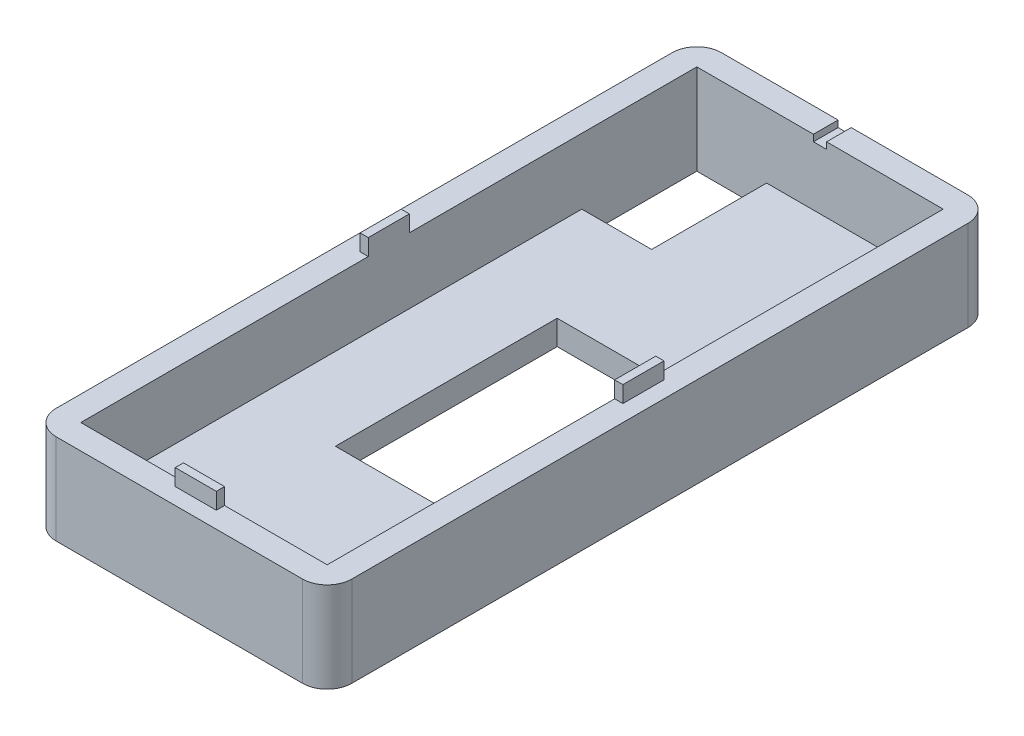
ISO-10303-21;
HEADER;
FILE_DESCRIPTION(('STEP AP214'),'2;1');
FILE_NAME('part.step','',(''),(''),'','','');
FILE_SCHEMA(('AUTOMOTIVE_DESIGN { 1 0 10303 214 1 1 1 1 }'));
ENDSEC;
DATA;
#1=APPLICATION_CONTEXT('core data for automotive mechanical design processes');
#2=APPLICATION_PROTOCOL_DEFINITION('international standard','automotive_design',2000,#1);
#3=PRODUCT_CONTEXT('',#1,'mechanical');
#4=PRODUCT('Part','Part','',(#3));
#5=PRODUCT_RELATED_PRODUCT_CATEGORY('part','',(#4));
#6=PRODUCT_DEFINITION_FORMATION('','',#4);
#7=PRODUCT_DEFINITION_CONTEXT('part definition',#1,'design');
#8=PRODUCT_DEFINITION('design','',#6,#7);
#9=PRODUCT_DEFINITION_SHAPE('','',#8);
#10=(LENGTH_UNIT() NAMED_UNIT(*) SI_UNIT(.MILLI.,.METRE.));
#11=(NAMED_UNIT(*) PLANE_ANGLE_UNIT() SI_UNIT($,.RADIAN.));
#12=(NAMED_UNIT(*) SI_UNIT($,.STERADIAN.) SOLID_ANGLE_UNIT());
#13=UNCERTAINTY_MEASURE_WITH_UNIT(LENGTH_MEASURE(1.E-05),#10,'distance_accuracy_value','');
#14=(GEOMETRIC_REPRESENTATION_CONTEXT(3) GLOBAL_UNCERTAINTY_ASSIGNED_CONTEXT((#13)) GLOBAL_UNIT_ASSIGNED_CONTEXT((#10,
#11,#12)) REPRESENTATION_CONTEXT('',''));
#15=CARTESIAN_POINT('',(0.,0.,0.));
#16=DIRECTION('',(0.,0.,1.));
#17=DIRECTION('',(1.,0.,0.));
#18=AXIS2_PLACEMENT_3D('',#15,#16,#17);
#19=CARTESIAN_POINT('',(0.,11.,0.));
#20=DIRECTION('',(0.,-1.,0.));
#21=DIRECTION('',(0.,0.,-1.));
#22=AXIS2_PLACEMENT_3D('',#19,#20,#21);
#23=PLANE('',#22);
#24=DIRECTION('',(0.,0.,1.));
#25=VECTOR('',#24,1.);
#26=CARTESIAN_POINT('',(15.5,11.,-3.));
#27=LINE('',#26,#25);
#28=CARTESIAN_POINT('',(15.5,11.,-3.));
#29=VERTEX_POINT('',#28);
#30=CARTESIAN_POINT('',(15.5,11.,-2.));
#31=VERTEX_POINT('',#30);
#32=EDGE_CURVE('E293',#29,#31,#27,.T.);
#33=ORIENTED_EDGE('',*,*,#32,.F.);
#34=DIRECTION('',(1.,0.,0.));
#35=VECTOR('',#34,1.);
#36=CARTESIAN_POINT('',(3.,11.,-3.));
#37=LINE('',#36,#35);
#38=CARTESIAN_POINT('',(3.,11.,-3.));
#39=VERTEX_POINT('',#38);
#40=EDGE_CURVE('E436',#39,#29,#37,.T.);
#41=ORIENTED_EDGE('',*,*,#40,.F.);
#42=DIRECTION('',(0.,0.,1.));
#43=VECTOR('',#42,1.);
#44=CARTESIAN_POINT('',(3.,11.,-3.));
#45=LINE('',#44,#43);
#46=CARTESIAN_POINT('',(3.,11.,-38.));
#47=VERTEX_POINT('',#46);
#48=EDGE_CURVE('E412',#47,#39,#45,.T.);
#49=ORIENTED_EDGE('',*,*,#48,.F.);
#50=DIRECTION('',(1.,0.,0.));
#51=VECTOR('',#50,1.);
#52=CARTESIAN_POINT('',(3.,11.,-38.));
#53=LINE('',#52,#51);
#54=CARTESIAN_POINT('',(2.,11.,-38.));
#55=VERTEX_POINT('',#54);
#56=EDGE_CURVE('E369',#55,#47,#53,.T.);
#57=ORIENTED_EDGE('',*,*,#56,.F.);
#58=DIRECTION('',(0.,0.,1.));
#59=VECTOR('',#58,1.);
#60=CARTESIAN_POINT('',(2.,11.,-43.));
#61=LINE('',#60,#59);
#62=CARTESIAN_POINT('',(2.,11.,-43.));
#63=VERTEX_POINT('',#62);
#64=EDGE_CURVE('E378',#63,#55,#61,.T.);
#65=ORIENTED_EDGE('',*,*,#64,.F.);
#66=DIRECTION('',(-1.,0.,0.));
#67=VECTOR('',#66,1.);
#68=CARTESIAN_POINT('',(3.,11.,-43.));
#69=LINE('',#68,#67);
#70=CARTESIAN_POINT('',(3.,11.,-43.));
#71=VERTEX_POINT('',#70);
#72=EDGE_CURVE('E364',#71,#63,#69,.T.);
#73=ORIENTED_EDGE('',*,*,#72,.F.);
#74=CARTESIAN_POINT('',(3.,11.,-78.));
#75=VERTEX_POINT('',#74);
#76=EDGE_CURVE('E432',#75,#71,#45,.T.);
#77=ORIENTED_EDGE('',*,*,#76,.F.);
#78=DIRECTION('',(-1.,0.,0.));
#79=VECTOR('',#78,1.);
#80=CARTESIAN_POINT('',(3.,11.,-78.));
#81=LINE('',#80,#79);
#82=CARTESIAN_POINT('',(17.2,11.,-78.));
#83=VERTEX_POINT('',#82);
#84=EDGE_CURVE('E443',#83,#75,#81,.T.);
#85=ORIENTED_EDGE('',*,*,#84,.F.);
#86=DIRECTION('',(0.,0.,1.));
#87=VECTOR('',#86,1.);
#88=CARTESIAN_POINT('',(17.2,11.,-81.));
#89=LINE('',#88,#87);
#90=CARTESIAN_POINT('',(17.2,11.,-81.));
#91=VERTEX_POINT('',#90);
#92=EDGE_CURVE('E394',#91,#83,#89,.T.);
#93=ORIENTED_EDGE('',*,*,#92,.F.);
#94=DIRECTION('',(-1.,0.,0.));
#95=VECTOR('',#94,1.);
#96=CARTESIAN_POINT('',(0.,11.,-81.));
#97=LINE('',#96,#95);
#98=CARTESIAN_POINT('',(3.,11.,-81.));
#99=VERTEX_POINT('',#98);
#100=EDGE_CURVE('E466',#91,#99,#97,.T.);
#101=ORIENTED_EDGE('',*,*,#100,.T.);
#102=CARTESIAN_POINT('',(3.,11.,-78.));
#103=DIRECTION('',(0.,-1.,0.));
#104=DIRECTION('',(0.,0.,-1.));
#105=AXIS2_PLACEMENT_3D('',#102,#103,#104);
#106=CIRCLE('',#105,3.);
#107=CARTESIAN_POINT('',(0.,11.,-78.));
#108=VERTEX_POINT('',#107);
#109=EDGE_CURVE('E498',#99,#108,#106,.F.);
#110=ORIENTED_EDGE('',*,*,#109,.T.);
#111=DIRECTION('',(0.,0.,1.));
#112=VECTOR('',#111,1.);
#113=CARTESIAN_POINT('',(0.,11.,0.));
#114=LINE('',#113,#112);
#115=CARTESIAN_POINT('',(0.,11.,-3.));
#116=VERTEX_POINT('',#115);
#117=EDGE_CURVE('E456',#108,#116,#114,.T.);
#118=ORIENTED_EDGE('',*,*,#117,.T.);
#119=CARTESIAN_POINT('',(3.,11.,-3.));
#120=DIRECTION('',(0.,-1.,0.));
#121=DIRECTION('',(0.,0.,-1.));
#122=AXIS2_PLACEMENT_3D('',#119,#120,#121);
#123=CIRCLE('',#122,3.);
#124=CARTESIAN_POINT('',(3.,11.,0.));
#125=VERTEX_POINT('',#124);
#126=EDGE_CURVE('E504',#116,#125,#123,.F.);
#127=ORIENTED_EDGE('',*,*,#126,.T.);
#128=DIRECTION('',(1.,0.,0.));
#129=VECTOR('',#128,1.);
#130=CARTESIAN_POINT('',(0.,11.,0.));
#131=LINE('',#130,#129);
#132=CARTESIAN_POINT('',(33.,11.,0.));
#133=VERTEX_POINT('',#132);
#134=EDGE_CURVE('E459',#125,#133,#131,.T.);
#135=ORIENTED_EDGE('',*,*,#134,.T.);
#136=CARTESIAN_POINT('',(33.,11.,-3.));
#137=DIRECTION('',(0.,-1.,0.));
#138=DIRECTION('',(0.,0.,-1.));
#139=AXIS2_PLACEMENT_3D('',#136,#137,#138);
#140=CIRCLE('',#139,3.);
#141=CARTESIAN_POINT('',(36.,11.,-3.));
#142=VERTEX_POINT('',#141);
#143=EDGE_CURVE('E502',#133,#142,#140,.F.);
#144=ORIENTED_EDGE('',*,*,#143,.T.);
#145=DIRECTION('',(0.,0.,-1.));
#146=VECTOR('',#145,1.);
#147=CARTESIAN_POINT('',(36.,11.,0.));
#148=LINE('',#147,#146);
#149=CARTESIAN_POINT('',(36.,11.,-78.));
#150=VERTEX_POINT('',#149);
#151=EDGE_CURVE('E463',#142,#150,#148,.T.);
#152=ORIENTED_EDGE('',*,*,#151,.T.);
#153=CARTESIAN_POINT('',(33.,11.,-78.));
#154=DIRECTION('',(0.,-1.,0.));
#155=DIRECTION('',(0.,0.,-1.));
#156=AXIS2_PLACEMENT_3D('',#153,#154,#155);
#157=CIRCLE('',#156,3.);
#158=CARTESIAN_POINT('',(33.,11.,-81.));
#159=VERTEX_POINT('',#158);
#160=EDGE_CURVE('E500',#150,#159,#157,.F.);
#161=ORIENTED_EDGE('',*,*,#160,.T.);
#162=CARTESIAN_POINT('',(18.8,11.,-81.));
#163=VERTEX_POINT('',#162);
#164=EDGE_CURVE('E467',#159,#163,#97,.T.);
#165=ORIENTED_EDGE('',*,*,#164,.T.);
#166=DIRECTION('',(0.,0.,-1.));
#167=VECTOR('',#166,1.);
#168=CARTESIAN_POINT('',(18.8,11.,-81.));
#169=LINE('',#168,#167);
#170=CARTESIAN_POINT('',(18.8,11.,-78.));
#171=VERTEX_POINT('',#170);
#172=EDGE_CURVE('E398',#171,#163,#169,.T.);
#173=ORIENTED_EDGE('',*,*,#172,.F.);
#174=CARTESIAN_POINT('',(33.,11.,-78.));
#175=VERTEX_POINT('',#174);
#176=EDGE_CURVE('E423',#175,#171,#81,.T.);
#177=ORIENTED_EDGE('',*,*,#176,.F.);
#178=DIRECTION('',(0.,0.,-1.));
#179=VECTOR('',#178,1.);
#180=CARTESIAN_POINT('',(33.,11.,-3.));
#181=LINE('',#180,#179);
#182=CARTESIAN_POINT('',(33.,11.,-43.));
#183=VERTEX_POINT('',#182);
#184=EDGE_CURVE('E439',#183,#175,#181,.T.);
#185=ORIENTED_EDGE('',*,*,#184,.F.);
#186=DIRECTION('',(-1.,0.,0.));
#187=VECTOR('',#186,1.);
#188=CARTESIAN_POINT('',(33.,11.,-43.));
#189=LINE('',#188,#187);
#190=CARTESIAN_POINT('',(34.,11.,-43.));
#191=VERTEX_POINT('',#190);
#192=EDGE_CURVE('E343',#191,#183,#189,.T.);
#193=ORIENTED_EDGE('',*,*,#192,.F.);
#194=DIRECTION('',(0.,0.,-1.));
#195=VECTOR('',#194,1.);
#196=CARTESIAN_POINT('',(34.,11.,-43.));
#197=LINE('',#196,#195);
#198=CARTESIAN_POINT('',(34.,11.,-38.));
#199=VERTEX_POINT('',#198);
#200=EDGE_CURVE('E351',#199,#191,#197,.T.);
#201=ORIENTED_EDGE('',*,*,#200,.F.);
#202=DIRECTION('',(1.,0.,0.));
#203=VECTOR('',#202,1.);
#204=CARTESIAN_POINT('',(33.,11.,-38.));
#205=LINE('',#204,#203);
#206=CARTESIAN_POINT('',(33.,11.,-38.));
#207=VERTEX_POINT('',#206);
#208=EDGE_CURVE('E338',#207,#199,#205,.T.);
#209=ORIENTED_EDGE('',*,*,#208,.F.);
#210=CARTESIAN_POINT('',(33.,11.,-3.));
#211=VERTEX_POINT('',#210);
#212=EDGE_CURVE('E440',#211,#207,#181,.T.);
#213=ORIENTED_EDGE('',*,*,#212,.F.);
#214=CARTESIAN_POINT('',(20.5,11.,-3.));
#215=VERTEX_POINT('',#214);
#216=EDGE_CURVE('E435',#215,#211,#37,.T.);
#217=ORIENTED_EDGE('',*,*,#216,.F.);
#218=DIRECTION('',(0.,0.,-1.));
#219=VECTOR('',#218,1.);
#220=CARTESIAN_POINT('',(20.5,11.,-3.));
#221=LINE('',#220,#219);
#222=CARTESIAN_POINT('',(20.5,11.,-2.));
#223=VERTEX_POINT('',#222);
#224=EDGE_CURVE('E317',#223,#215,#221,.T.);
#225=ORIENTED_EDGE('',*,*,#224,.F.);
#226=DIRECTION('',(1.,0.,0.));
#227=VECTOR('',#226,1.);
#228=CARTESIAN_POINT('',(15.5,11.,-2.));
#229=LINE('',#228,#227);
#230=EDGE_CURVE('E326',#31,#223,#229,.T.);
#231=ORIENTED_EDGE('',*,*,#230,.F.);
#232=EDGE_LOOP('',(#33,#41,#49,#57,#65,#73,#77,#85,#93,#101,#110,#118,#127,#135,#144,#152,#161,
#165,#173,#177,#185,#193,#201,#209,#213,#217,#225,#231));
#233=FACE_BOUND('',#232,.T.);
#234=ADVANCED_FACE('F36',(#233),#23,.F.);
#235=CARTESIAN_POINT('',(0.,11.,0.));
#236=DIRECTION('',(1.,0.,0.));
#237=DIRECTION('',(0.,0.,-1.));
#238=AXIS2_PLACEMENT_3D('',#235,#236,#237);
#239=PLANE('',#238);
#240=DIRECTION('',(0.,0.,1.));
#241=VECTOR('',#240,1.);
#242=CARTESIAN_POINT('',(0.,0.,0.));
#243=LINE('',#242,#241);
#244=CARTESIAN_POINT('',(0.,0.,-78.));
#245=VERTEX_POINT('',#244);
#246=CARTESIAN_POINT('',(0.,0.,-3.));
#247=VERTEX_POINT('',#246);
#248=EDGE_CURVE('E447',#245,#247,#243,.T.);
#249=ORIENTED_EDGE('',*,*,#248,.T.);
#250=DIRECTION('',(0.,-1.,0.));
#251=VECTOR('',#250,1.);
#252=CARTESIAN_POINT('',(0.,11.,-3.));
#253=LINE('',#252,#251);
#254=EDGE_CURVE('E496',#247,#116,#253,.F.);
#255=ORIENTED_EDGE('',*,*,#254,.T.);
#256=ORIENTED_EDGE('',*,*,#117,.F.);
#257=DIRECTION('',(0.,-1.,0.));
#258=VECTOR('',#257,1.);
#259=CARTESIAN_POINT('',(0.,11.,-78.));
#260=LINE('',#259,#258);
#261=EDGE_CURVE('E493',#108,#245,#260,.T.);
#262=ORIENTED_EDGE('',*,*,#261,.T.);
#263=EDGE_LOOP('',(#249,#255,#256,#262));
#264=FACE_BOUND('',#263,.T.);
#265=ADVANCED_FACE('F585',(#264),#239,.F.);
#266=CARTESIAN_POINT('',(0.,11.,0.));
#267=DIRECTION('',(0.,0.,-1.));
#268=DIRECTION('',(-1.,0.,0.));
#269=AXIS2_PLACEMENT_3D('',#266,#267,#268);
#270=PLANE('',#269);
#271=ORIENTED_EDGE('',*,*,#134,.F.);
#272=DIRECTION('',(0.,-1.,0.));
#273=VECTOR('',#272,1.);
#274=CARTESIAN_POINT('',(3.,11.,0.));
#275=LINE('',#274,#273);
#276=CARTESIAN_POINT('',(3.,0.,0.));
#277=VERTEX_POINT('',#276);
#278=EDGE_CURVE('E482',#125,#277,#275,.T.);
#279=ORIENTED_EDGE('',*,*,#278,.T.);
#280=DIRECTION('',(1.,0.,0.));
#281=VECTOR('',#280,1.);
#282=CARTESIAN_POINT('',(0.,0.,0.));
#283=LINE('',#282,#281);
#284=CARTESIAN_POINT('',(33.,0.,0.));
#285=VERTEX_POINT('',#284);
#286=EDGE_CURVE('E473',#277,#285,#283,.T.);
#287=ORIENTED_EDGE('',*,*,#286,.T.);
#288=DIRECTION('',(0.,-1.,0.));
#289=VECTOR('',#288,1.);
#290=CARTESIAN_POINT('',(33.,11.,0.));
#291=LINE('',#290,#289);
#292=EDGE_CURVE('E470',#285,#133,#291,.F.);
#293=ORIENTED_EDGE('',*,*,#292,.T.);
#294=EDGE_LOOP('',(#271,#279,#287,#293));
#295=FACE_BOUND('',#294,.T.);
#296=ADVANCED_FACE('F590',(#295),#270,.F.);
#297=CARTESIAN_POINT('',(36.,11.,0.));
#298=DIRECTION('',(-1.,0.,0.));
#299=DIRECTION('',(0.,0.,1.));
#300=AXIS2_PLACEMENT_3D('',#297,#298,#299);
#301=PLANE('',#300);
#302=ORIENTED_EDGE('',*,*,#151,.F.);
#303=DIRECTION('',(0.,-1.,0.));
#304=VECTOR('',#303,1.);
#305=CARTESIAN_POINT('',(36.,11.,-3.));
#306=LINE('',#305,#304);
#307=CARTESIAN_POINT('',(36.,0.,-3.));
#308=VERTEX_POINT('',#307);
#309=EDGE_CURVE('E508',#142,#308,#306,.T.);
#310=ORIENTED_EDGE('',*,*,#309,.T.);
#311=DIRECTION('',(0.,0.,-1.));
#312=VECTOR('',#311,1.);
#313=CARTESIAN_POINT('',(36.,0.,0.));
#314=LINE('',#313,#312);
#315=CARTESIAN_POINT('',(36.,0.,-78.));
#316=VERTEX_POINT('',#315);
#317=EDGE_CURVE('E476',#308,#316,#314,.T.);
#318=ORIENTED_EDGE('',*,*,#317,.T.);
#319=DIRECTION('',(0.,-1.,0.));
#320=VECTOR('',#319,1.);
#321=CARTESIAN_POINT('',(36.,11.,-78.));
#322=LINE('',#321,#320);
#323=EDGE_CURVE('E506',#316,#150,#322,.F.);
#324=ORIENTED_EDGE('',*,*,#323,.T.);
#325=EDGE_LOOP('',(#302,#310,#318,#324));
#326=FACE_BOUND('',#325,.T.);
#327=ADVANCED_FACE('F600',(#326),#301,.F.);
#328=CARTESIAN_POINT('',(0.,11.,-81.));
#329=DIRECTION('',(0.,0.,1.));
#330=DIRECTION('',(1.,0.,0.));
#331=AXIS2_PLACEMENT_3D('',#328,#329,#330);
#332=PLANE('',#331);
#333=ORIENTED_EDGE('',*,*,#100,.F.);
#334=DIRECTION('',(0.,1.,0.));
#335=VECTOR('',#334,1.);
#336=CARTESIAN_POINT('',(17.2,10.2,-81.));
#337=LINE('',#336,#335);
#338=CARTESIAN_POINT('',(17.2,10.2,-81.));
#339=VERTEX_POINT('',#338);
#340=EDGE_CURVE('E410',#339,#91,#337,.T.);
#341=ORIENTED_EDGE('',*,*,#340,.F.);
#342=DIRECTION('',(-1.,0.,0.));
#343=VECTOR('',#342,1.);
#344=CARTESIAN_POINT('',(17.2,10.2,-81.));
#345=LINE('',#344,#343);
#346=CARTESIAN_POINT('',(18.8,10.2,-81.));
#347=VERTEX_POINT('',#346);
#348=EDGE_CURVE('E404',#347,#339,#345,.T.);
#349=ORIENTED_EDGE('',*,*,#348,.F.);
#350=DIRECTION('',(0.,1.,0.));
#351=VECTOR('',#350,1.);
#352=CARTESIAN_POINT('',(18.8,10.2,-81.));
#353=LINE('',#352,#351);
#354=EDGE_CURVE('E413',#347,#163,#353,.T.);
#355=ORIENTED_EDGE('',*,*,#354,.T.);
#356=ORIENTED_EDGE('',*,*,#164,.F.);
#357=DIRECTION('',(0.,-1.,0.));
#358=VECTOR('',#357,1.);
#359=CARTESIAN_POINT('',(33.,11.,-81.));
#360=LINE('',#359,#358);
#361=CARTESIAN_POINT('',(33.,0.,-81.));
#362=VERTEX_POINT('',#361);
#363=EDGE_CURVE('E514',#159,#362,#360,.T.);
#364=ORIENTED_EDGE('',*,*,#363,.T.);
#365=DIRECTION('',(-1.,0.,0.));
#366=VECTOR('',#365,1.);
#367=CARTESIAN_POINT('',(0.,0.,-81.));
#368=LINE('',#367,#366);
#369=CARTESIAN_POINT('',(3.,0.,-81.));
#370=VERTEX_POINT('',#369);
#371=EDGE_CURVE('E460',#362,#370,#368,.T.);
#372=ORIENTED_EDGE('',*,*,#371,.T.);
#373=DIRECTION('',(0.,-1.,0.));
#374=VECTOR('',#373,1.);
#375=CARTESIAN_POINT('',(3.,11.,-81.));
#376=LINE('',#375,#374);
#377=EDGE_CURVE('E511',#370,#99,#376,.F.);
#378=ORIENTED_EDGE('',*,*,#377,.T.);
#379=EDGE_LOOP('',(#333,#341,#349,#355,#356,#364,#372,#378));
#380=FACE_BOUND('',#379,.T.);
#381=ADVANCED_FACE('F546',(#380),#332,.F.);
#382=CARTESIAN_POINT('',(0.,0.,0.));
#383=DIRECTION('',(0.,-1.,0.));
#384=DIRECTION('',(0.,0.,-1.));
#385=AXIS2_PLACEMENT_3D('',#382,#383,#384);
#386=PLANE('',#385);
#387=DIRECTION('',(0.,0.,-1.));
#388=VECTOR('',#387,1.);
#389=CARTESIAN_POINT('',(3.,0.,-78.));
#390=LINE('',#389,#388);
#391=CARTESIAN_POINT('',(3.,0.,-64.));
#392=VERTEX_POINT('',#391);
#393=CARTESIAN_POINT('',(3.,0.,-78.));
#394=VERTEX_POINT('',#393);
#395=EDGE_CURVE('E282',#392,#394,#390,.T.);
#396=ORIENTED_EDGE('',*,*,#395,.F.);
#397=DIRECTION('',(-1.,0.,0.));
#398=VECTOR('',#397,1.);
#399=CARTESIAN_POINT('',(3.,0.,-64.));
#400=LINE('',#399,#398);
#401=CARTESIAN_POINT('',(11.5,0.,-64.));
#402=VERTEX_POINT('',#401);
#403=EDGE_CURVE('E275',#402,#392,#400,.T.);
#404=ORIENTED_EDGE('',*,*,#403,.F.);
#405=DIRECTION('',(0.,0.,1.));
#406=VECTOR('',#405,1.);
#407=CARTESIAN_POINT('',(11.5,0.,-78.));
#408=LINE('',#407,#406);
#409=CARTESIAN_POINT('',(11.5,0.,-78.));
#410=VERTEX_POINT('',#409);
#411=EDGE_CURVE('E269',#410,#402,#408,.T.);
#412=ORIENTED_EDGE('',*,*,#411,.F.);
#413=DIRECTION('',(1.,0.,0.));
#414=VECTOR('',#413,1.);
#415=CARTESIAN_POINT('',(3.,0.,-78.));
#416=LINE('',#415,#414);
#417=EDGE_CURVE('E278',#394,#410,#416,.T.);
#418=ORIENTED_EDGE('',*,*,#417,.F.);
#419=EDGE_LOOP('',(#396,#404,#412,#418));
#420=FACE_BOUND('',#419,.T.);
#421=DIRECTION('',(0.,0.,1.));
#422=VECTOR('',#421,1.);
#423=CARTESIAN_POINT('',(28.,0.,-51.));
#424=LINE('',#423,#422);
#425=CARTESIAN_POINT('',(28.,0.,-51.));
#426=VERTEX_POINT('',#425);
#427=CARTESIAN_POINT('',(28.,0.,-24.));
#428=VERTEX_POINT('',#427);
#429=EDGE_CURVE('E59',#426,#428,#424,.T.);
#430=ORIENTED_EDGE('',*,*,#429,.F.);
#431=DIRECTION('',(1.,0.,0.));
#432=VECTOR('',#431,1.);
#433=CARTESIAN_POINT('',(28.,0.,-51.));
#434=LINE('',#433,#432);
#435=CARTESIAN_POINT('',(13.,0.,-51.));
#436=VERTEX_POINT('',#435);
#437=EDGE_CURVE('E302',#436,#426,#434,.T.);
#438=ORIENTED_EDGE('',*,*,#437,.F.);
#439=DIRECTION('',(0.,0.,-1.));
#440=VECTOR('',#439,1.);
#441=CARTESIAN_POINT('',(13.,0.,-51.));
#442=LINE('',#441,#440);
#443=CARTESIAN_POINT('',(13.,0.,-24.));
#444=VERTEX_POINT('',#443);
#445=EDGE_CURVE('E299',#444,#436,#442,.T.);
#446=ORIENTED_EDGE('',*,*,#445,.F.);
#447=DIRECTION('',(-1.,0.,0.));
#448=VECTOR('',#447,1.);
#449=CARTESIAN_POINT('',(28.,0.,-24.));
#450=LINE('',#449,#448);
#451=EDGE_CURVE('E296',#428,#444,#450,.T.);
#452=ORIENTED_EDGE('',*,*,#451,.F.);
#453=EDGE_LOOP('',(#430,#438,#446,#452));
#454=FACE_BOUND('',#453,.T.);
#455=ORIENTED_EDGE('',*,*,#286,.F.);
#456=CARTESIAN_POINT('',(3.,0.,-3.));
#457=DIRECTION('',(0.,-1.,0.));
#458=DIRECTION('',(0.,0.,-1.));
#459=AXIS2_PLACEMENT_3D('',#456,#457,#458);
#460=CIRCLE('',#459,3.);
#461=EDGE_CURVE('E491',#277,#247,#460,.T.);
#462=ORIENTED_EDGE('',*,*,#461,.T.);
#463=ORIENTED_EDGE('',*,*,#248,.F.);
#464=CARTESIAN_POINT('',(3.,0.,-78.));
#465=DIRECTION('',(0.,-1.,0.));
#466=DIRECTION('',(0.,0.,-1.));
#467=AXIS2_PLACEMENT_3D('',#464,#465,#466);
#468=CIRCLE('',#467,3.);
#469=EDGE_CURVE('E485',#245,#370,#468,.T.);
#470=ORIENTED_EDGE('',*,*,#469,.T.);
#471=ORIENTED_EDGE('',*,*,#371,.F.);
#472=CARTESIAN_POINT('',(33.,0.,-78.));
#473=DIRECTION('',(0.,-1.,0.));
#474=DIRECTION('',(0.,0.,-1.));
#475=AXIS2_PLACEMENT_3D('',#472,#473,#474);
#476=CIRCLE('',#475,3.);
#477=EDGE_CURVE('E487',#362,#316,#476,.T.);
#478=ORIENTED_EDGE('',*,*,#477,.T.);
#479=ORIENTED_EDGE('',*,*,#317,.F.);
#480=CARTESIAN_POINT('',(33.,0.,-3.));
#481=DIRECTION('',(0.,-1.,0.));
#482=DIRECTION('',(0.,0.,-1.));
#483=AXIS2_PLACEMENT_3D('',#480,#481,#482);
#484=CIRCLE('',#483,3.);
#485=EDGE_CURVE('E489',#308,#285,#484,.T.);
#486=ORIENTED_EDGE('',*,*,#485,.T.);
#487=EDGE_LOOP('',(#455,#462,#463,#470,#471,#478,#479,#486));
#488=FACE_BOUND('',#487,.T.);
#489=ADVANCED_FACE('F284',(#420,#454,#488),#386,.T.);
#490=CARTESIAN_POINT('',(3.,3.,-3.));
#491=DIRECTION('',(-1.,0.,0.));
#492=DIRECTION('',(0.,0.,1.));
#493=AXIS2_PLACEMENT_3D('',#490,#491,#492);
#494=PLANE('',#493);
#495=DIRECTION('',(0.,0.,1.));
#496=VECTOR('',#495,1.);
#497=CARTESIAN_POINT('',(3.,3.,-3.));
#498=LINE('',#497,#496);
#499=CARTESIAN_POINT('',(3.,3.,-64.));
#500=VERTEX_POINT('',#499);
#501=CARTESIAN_POINT('',(3.,3.,-3.));
#502=VERTEX_POINT('',#501);
#503=EDGE_CURVE('E420',#500,#502,#498,.T.);
#504=ORIENTED_EDGE('',*,*,#503,.F.);
#505=DIRECTION('',(0.,-1.,0.));
#506=VECTOR('',#505,1.);
#507=CARTESIAN_POINT('',(3.,8.,-64.));
#508=LINE('',#507,#506);
#509=EDGE_CURVE('E291',#500,#392,#508,.T.);
#510=ORIENTED_EDGE('',*,*,#509,.T.);
#511=ORIENTED_EDGE('',*,*,#395,.T.);
#512=DIRECTION('',(0.,1.,0.));
#513=VECTOR('',#512,1.);
#514=CARTESIAN_POINT('',(3.,3.,-78.));
#515=LINE('',#514,#513);
#516=EDGE_CURVE('E51',#394,#75,#515,.T.);
#517=ORIENTED_EDGE('',*,*,#516,.T.);
#518=ORIENTED_EDGE('',*,*,#76,.T.);
#519=DIRECTION('',(0.,-1.,0.));
#520=VECTOR('',#519,1.);
#521=CARTESIAN_POINT('',(3.,13.,-43.));
#522=LINE('',#521,#520);
#523=CARTESIAN_POINT('',(3.,13.,-43.));
#524=VERTEX_POINT('',#523);
#525=EDGE_CURVE('E391',#524,#71,#522,.T.);
#526=ORIENTED_EDGE('',*,*,#525,.F.);
#527=DIRECTION('',(0.,0.,-1.));
#528=VECTOR('',#527,1.);
#529=CARTESIAN_POINT('',(3.,13.,-43.));
#530=LINE('',#529,#528);
#531=CARTESIAN_POINT('',(3.,13.,-38.));
#532=VERTEX_POINT('',#531);
#533=EDGE_CURVE('E365',#532,#524,#530,.T.);
#534=ORIENTED_EDGE('',*,*,#533,.F.);
#535=DIRECTION('',(0.,-1.,0.));
#536=VECTOR('',#535,1.);
#537=CARTESIAN_POINT('',(3.,13.,-38.));
#538=LINE('',#537,#536);
#539=EDGE_CURVE('E375',#532,#47,#538,.T.);
#540=ORIENTED_EDGE('',*,*,#539,.T.);
#541=ORIENTED_EDGE('',*,*,#48,.T.);
#542=DIRECTION('',(0.,1.,0.));
#543=VECTOR('',#542,1.);
#544=CARTESIAN_POINT('',(3.,3.,-3.));
#545=LINE('',#544,#543);
#546=EDGE_CURVE('E431',#502,#39,#545,.T.);
#547=ORIENTED_EDGE('',*,*,#546,.F.);
#548=EDGE_LOOP('',(#504,#510,#511,#517,#518,#526,#534,#540,#541,#547));
#549=FACE_BOUND('',#548,.T.);
#550=ADVANCED_FACE('F559',(#549),#494,.F.);
#551=CARTESIAN_POINT('',(3.,3.,-78.));
#552=DIRECTION('',(0.,0.,-1.));
#553=DIRECTION('',(-1.,0.,0.));
#554=AXIS2_PLACEMENT_3D('',#551,#552,#553);
#555=PLANE('',#554);
#556=DIRECTION('',(0.,-1.,0.));
#557=VECTOR('',#556,1.);
#558=CARTESIAN_POINT('',(11.5,8.,-78.));
#559=LINE('',#558,#557);
#560=CARTESIAN_POINT('',(11.5,3.,-78.));
#561=VERTEX_POINT('',#560);
#562=EDGE_CURVE('E265',#561,#410,#559,.T.);
#563=ORIENTED_EDGE('',*,*,#562,.F.);
#564=DIRECTION('',(-1.,0.,0.));
#565=VECTOR('',#564,1.);
#566=CARTESIAN_POINT('',(3.,3.,-78.));
#567=LINE('',#566,#565);
#568=CARTESIAN_POINT('',(33.,3.,-78.));
#569=VERTEX_POINT('',#568);
#570=EDGE_CURVE('E429',#569,#561,#567,.T.);
#571=ORIENTED_EDGE('',*,*,#570,.F.);
#572=DIRECTION('',(0.,1.,0.));
#573=VECTOR('',#572,1.);
#574=CARTESIAN_POINT('',(33.,3.,-78.));
#575=LINE('',#574,#573);
#576=EDGE_CURVE('E448',#569,#175,#575,.T.);
#577=ORIENTED_EDGE('',*,*,#576,.T.);
#578=ORIENTED_EDGE('',*,*,#176,.T.);
#579=DIRECTION('',(0.,1.,0.));
#580=VECTOR('',#579,1.);
#581=CARTESIAN_POINT('',(18.8,10.2,-78.));
#582=LINE('',#581,#580);
#583=CARTESIAN_POINT('',(18.8,10.2,-78.));
#584=VERTEX_POINT('',#583);
#585=EDGE_CURVE('E416',#584,#171,#582,.T.);
#586=ORIENTED_EDGE('',*,*,#585,.F.);
#587=DIRECTION('',(1.,0.,0.));
#588=VECTOR('',#587,1.);
#589=CARTESIAN_POINT('',(17.2,10.2,-78.));
#590=LINE('',#589,#588);
#591=CARTESIAN_POINT('',(17.2,10.2,-78.));
#592=VERTEX_POINT('',#591);
#593=EDGE_CURVE('E397',#592,#584,#590,.T.);
#594=ORIENTED_EDGE('',*,*,#593,.F.);
#595=DIRECTION('',(0.,1.,0.));
#596=VECTOR('',#595,1.);
#597=CARTESIAN_POINT('',(17.2,10.2,-78.));
#598=LINE('',#597,#596);
#599=EDGE_CURVE('E407',#592,#83,#598,.T.);
#600=ORIENTED_EDGE('',*,*,#599,.T.);
#601=ORIENTED_EDGE('',*,*,#84,.T.);
#602=ORIENTED_EDGE('',*,*,#516,.F.);
#603=ORIENTED_EDGE('',*,*,#417,.T.);
#604=EDGE_LOOP('',(#563,#571,#577,#578,#586,#594,#600,#601,#602,#603));
#605=FACE_BOUND('',#604,.T.);
#606=ADVANCED_FACE('F279',(#605),#555,.F.);
#607=CARTESIAN_POINT('',(33.,3.,-3.));
#608=DIRECTION('',(1.,0.,0.));
#609=DIRECTION('',(0.,0.,-1.));
#610=AXIS2_PLACEMENT_3D('',#607,#608,#609);
#611=PLANE('',#610);
#612=ORIENTED_EDGE('',*,*,#212,.T.);
#613=DIRECTION('',(0.,-1.,0.));
#614=VECTOR('',#613,1.);
#615=CARTESIAN_POINT('',(33.,13.,-38.));
#616=LINE('',#615,#614);
#617=CARTESIAN_POINT('',(33.,13.,-38.));
#618=VERTEX_POINT('',#617);
#619=EDGE_CURVE('E362',#618,#207,#616,.T.);
#620=ORIENTED_EDGE('',*,*,#619,.F.);
#621=DIRECTION('',(0.,0.,1.));
#622=VECTOR('',#621,1.);
#623=CARTESIAN_POINT('',(33.,13.,-43.));
#624=LINE('',#623,#622);
#625=CARTESIAN_POINT('',(33.,13.,-43.));
#626=VERTEX_POINT('',#625);
#627=EDGE_CURVE('E339',#626,#618,#624,.T.);
#628=ORIENTED_EDGE('',*,*,#627,.F.);
#629=DIRECTION('',(0.,-1.,0.));
#630=VECTOR('',#629,1.);
#631=CARTESIAN_POINT('',(33.,13.,-43.));
#632=LINE('',#631,#630);
#633=EDGE_CURVE('E349',#626,#183,#632,.T.);
#634=ORIENTED_EDGE('',*,*,#633,.T.);
#635=ORIENTED_EDGE('',*,*,#184,.T.);
#636=ORIENTED_EDGE('',*,*,#576,.F.);
#637=DIRECTION('',(0.,0.,-1.));
#638=VECTOR('',#637,1.);
#639=CARTESIAN_POINT('',(33.,3.,-3.));
#640=LINE('',#639,#638);
#641=CARTESIAN_POINT('',(33.,3.,-3.));
#642=VERTEX_POINT('',#641);
#643=EDGE_CURVE('E426',#642,#569,#640,.T.);
#644=ORIENTED_EDGE('',*,*,#643,.F.);
#645=DIRECTION('',(0.,1.,0.));
#646=VECTOR('',#645,1.);
#647=CARTESIAN_POINT('',(33.,3.,-3.));
#648=LINE('',#647,#646);
#649=EDGE_CURVE('E451',#642,#211,#648,.T.);
#650=ORIENTED_EDGE('',*,*,#649,.T.);
#651=EDGE_LOOP('',(#612,#620,#628,#634,#635,#636,#644,#650));
#652=FACE_BOUND('',#651,.T.);
#653=ADVANCED_FACE('F657',(#652),#611,.F.);
#654=CARTESIAN_POINT('',(3.,3.,-3.));
#655=DIRECTION('',(0.,0.,1.));
#656=DIRECTION('',(1.,0.,0.));
#657=AXIS2_PLACEMENT_3D('',#654,#655,#656);
#658=PLANE('',#657);
#659=ORIENTED_EDGE('',*,*,#40,.T.);
#660=DIRECTION('',(0.,-1.,0.));
#661=VECTOR('',#660,1.);
#662=CARTESIAN_POINT('',(15.5,13.,-3.));
#663=LINE('',#662,#661);
#664=CARTESIAN_POINT('',(15.5,13.,-3.));
#665=VERTEX_POINT('',#664);
#666=EDGE_CURVE('E323',#665,#29,#663,.T.);
#667=ORIENTED_EDGE('',*,*,#666,.F.);
#668=DIRECTION('',(-1.,0.,0.));
#669=VECTOR('',#668,1.);
#670=CARTESIAN_POINT('',(15.5,13.,-3.));
#671=LINE('',#670,#669);
#672=CARTESIAN_POINT('',(20.5,13.,-3.));
#673=VERTEX_POINT('',#672);
#674=EDGE_CURVE('E321',#673,#665,#671,.T.);
#675=ORIENTED_EDGE('',*,*,#674,.F.);
#676=DIRECTION('',(0.,-1.,0.));
#677=VECTOR('',#676,1.);
#678=CARTESIAN_POINT('',(20.5,13.,-3.));
#679=LINE('',#678,#677);
#680=EDGE_CURVE('E331',#673,#215,#679,.T.);
#681=ORIENTED_EDGE('',*,*,#680,.T.);
#682=ORIENTED_EDGE('',*,*,#216,.T.);
#683=ORIENTED_EDGE('',*,*,#649,.F.);
#684=DIRECTION('',(1.,0.,0.));
#685=VECTOR('',#684,1.);
#686=CARTESIAN_POINT('',(3.,3.,-3.));
#687=LINE('',#686,#685);
#688=EDGE_CURVE('E422',#502,#642,#687,.T.);
#689=ORIENTED_EDGE('',*,*,#688,.F.);
#690=ORIENTED_EDGE('',*,*,#546,.T.);
#691=EDGE_LOOP('',(#659,#667,#675,#681,#682,#683,#689,#690));
#692=FACE_BOUND('',#691,.T.);
#693=ADVANCED_FACE('F653',(#692),#658,.F.);
#694=CARTESIAN_POINT('',(0.,3.,0.));
#695=DIRECTION('',(0.,-1.,0.));
#696=DIRECTION('',(0.,0.,-1.));
#697=AXIS2_PLACEMENT_3D('',#694,#695,#696);
#698=PLANE('',#697);
#699=DIRECTION('',(1.,0.,0.));
#700=VECTOR('',#699,1.);
#701=CARTESIAN_POINT('',(0.,3.,-51.));
#702=LINE('',#701,#700);
#703=CARTESIAN_POINT('',(13.,3.,-51.));
#704=VERTEX_POINT('',#703);
#705=CARTESIAN_POINT('',(28.,3.,-51.));
#706=VERTEX_POINT('',#705);
#707=EDGE_CURVE('E523',#704,#706,#702,.T.);
#708=ORIENTED_EDGE('',*,*,#707,.T.);
#709=DIRECTION('',(0.,0.,1.));
#710=VECTOR('',#709,1.);
#711=CARTESIAN_POINT('',(28.,3.,0.));
#712=LINE('',#711,#710);
#713=CARTESIAN_POINT('',(28.,3.,-24.));
#714=VERTEX_POINT('',#713);
#715=EDGE_CURVE('E526',#706,#714,#712,.T.);
#716=ORIENTED_EDGE('',*,*,#715,.T.);
#717=DIRECTION('',(-1.,0.,0.));
#718=VECTOR('',#717,1.);
#719=CARTESIAN_POINT('',(0.,3.,-24.));
#720=LINE('',#719,#718);
#721=CARTESIAN_POINT('',(13.,3.,-24.));
#722=VERTEX_POINT('',#721);
#723=EDGE_CURVE('E517',#714,#722,#720,.T.);
#724=ORIENTED_EDGE('',*,*,#723,.T.);
#725=DIRECTION('',(0.,0.,-1.));
#726=VECTOR('',#725,1.);
#727=CARTESIAN_POINT('',(13.,3.,0.));
#728=LINE('',#727,#726);
#729=EDGE_CURVE('E520',#722,#704,#728,.T.);
#730=ORIENTED_EDGE('',*,*,#729,.T.);
#731=EDGE_LOOP('',(#708,#716,#724,#730));
#732=FACE_BOUND('',#731,.T.);
#733=DIRECTION('',(0.,0.,1.));
#734=VECTOR('',#733,1.);
#735=CARTESIAN_POINT('',(11.5,3.,0.));
#736=LINE('',#735,#734);
#737=CARTESIAN_POINT('',(11.5,3.,-64.));
#738=VERTEX_POINT('',#737);
#739=EDGE_CURVE('E44',#561,#738,#736,.T.);
#740=ORIENTED_EDGE('',*,*,#739,.T.);
#741=DIRECTION('',(-1.,0.,0.));
#742=VECTOR('',#741,1.);
#743=CARTESIAN_POINT('',(0.,3.,-64.));
#744=LINE('',#743,#742);
#745=EDGE_CURVE('E11',#738,#500,#744,.T.);
#746=ORIENTED_EDGE('',*,*,#745,.T.);
#747=ORIENTED_EDGE('',*,*,#503,.T.);
#748=ORIENTED_EDGE('',*,*,#688,.T.);
#749=ORIENTED_EDGE('',*,*,#643,.T.);
#750=ORIENTED_EDGE('',*,*,#570,.T.);
#751=EDGE_LOOP('',(#740,#746,#747,#748,#749,#750));
#752=FACE_BOUND('',#751,.T.);
#753=ADVANCED_FACE('F529',(#732,#752),#698,.F.);
#754=CARTESIAN_POINT('',(3.,11.,-3.));
#755=DIRECTION('',(0.,-1.,0.));
#756=DIRECTION('',(0.,0.,-1.));
#757=AXIS2_PLACEMENT_3D('',#754,#755,#756);
#758=CYLINDRICAL_SURFACE('',#757,3.);
#759=ORIENTED_EDGE('',*,*,#126,.F.);
#760=ORIENTED_EDGE('',*,*,#254,.F.);
#761=ORIENTED_EDGE('',*,*,#461,.F.);
#762=ORIENTED_EDGE('',*,*,#278,.F.);
#763=EDGE_LOOP('',(#759,#760,#761,#762));
#764=FACE_BOUND('',#763,.T.);
#765=ADVANCED_FACE('F607',(#764),#758,.T.);
#766=CARTESIAN_POINT('',(33.,11.,-3.));
#767=DIRECTION('',(0.,-1.,0.));
#768=DIRECTION('',(0.,0.,-1.));
#769=AXIS2_PLACEMENT_3D('',#766,#767,#768);
#770=CYLINDRICAL_SURFACE('',#769,3.);
#771=ORIENTED_EDGE('',*,*,#143,.F.);
#772=ORIENTED_EDGE('',*,*,#292,.F.);
#773=ORIENTED_EDGE('',*,*,#485,.F.);
#774=ORIENTED_EDGE('',*,*,#309,.F.);
#775=EDGE_LOOP('',(#771,#772,#773,#774));
#776=FACE_BOUND('',#775,.T.);
#777=ADVANCED_FACE('F610',(#776),#770,.T.);
#778=CARTESIAN_POINT('',(33.,11.,-78.));
#779=DIRECTION('',(0.,-1.,0.));
#780=DIRECTION('',(0.,0.,-1.));
#781=AXIS2_PLACEMENT_3D('',#778,#779,#780);
#782=CYLINDRICAL_SURFACE('',#781,3.);
#783=ORIENTED_EDGE('',*,*,#160,.F.);
#784=ORIENTED_EDGE('',*,*,#323,.F.);
#785=ORIENTED_EDGE('',*,*,#477,.F.);
#786=ORIENTED_EDGE('',*,*,#363,.F.);
#787=EDGE_LOOP('',(#783,#784,#785,#786));
#788=FACE_BOUND('',#787,.T.);
#789=ADVANCED_FACE('F613',(#788),#782,.T.);
#790=CARTESIAN_POINT('',(3.,11.,-78.));
#791=DIRECTION('',(0.,-1.,0.));
#792=DIRECTION('',(0.,0.,-1.));
#793=AXIS2_PLACEMENT_3D('',#790,#791,#792);
#794=CYLINDRICAL_SURFACE('',#793,3.);
#795=ORIENTED_EDGE('',*,*,#109,.F.);
#796=ORIENTED_EDGE('',*,*,#377,.F.);
#797=ORIENTED_EDGE('',*,*,#469,.F.);
#798=ORIENTED_EDGE('',*,*,#261,.F.);
#799=EDGE_LOOP('',(#795,#796,#797,#798));
#800=FACE_BOUND('',#799,.T.);
#801=ADVANCED_FACE('F38',(#800),#794,.T.);
#802=CARTESIAN_POINT('',(17.2,10.2,-81.));
#803=DIRECTION('',(-1.,0.,0.));
#804=DIRECTION('',(0.,0.,1.));
#805=AXIS2_PLACEMENT_3D('',#802,#803,#804);
#806=PLANE('',#805);
#807=ORIENTED_EDGE('',*,*,#92,.T.);
#808=ORIENTED_EDGE('',*,*,#599,.F.);
#809=DIRECTION('',(0.,0.,1.));
#810=VECTOR('',#809,1.);
#811=CARTESIAN_POINT('',(17.2,10.2,-81.));
#812=LINE('',#811,#810);
#813=EDGE_CURVE('E395',#339,#592,#812,.T.);
#814=ORIENTED_EDGE('',*,*,#813,.F.);
#815=ORIENTED_EDGE('',*,*,#340,.T.);
#816=EDGE_LOOP('',(#807,#808,#814,#815));
#817=FACE_BOUND('',#816,.T.);
#818=ADVANCED_FACE('F620',(#817),#806,.F.);
#819=CARTESIAN_POINT('',(18.8,10.2,-81.));
#820=DIRECTION('',(1.,0.,0.));
#821=DIRECTION('',(0.,0.,-1.));
#822=AXIS2_PLACEMENT_3D('',#819,#820,#821);
#823=PLANE('',#822);
#824=ORIENTED_EDGE('',*,*,#172,.T.);
#825=ORIENTED_EDGE('',*,*,#354,.F.);
#826=DIRECTION('',(0.,0.,-1.));
#827=VECTOR('',#826,1.);
#828=CARTESIAN_POINT('',(18.8,10.2,-81.));
#829=LINE('',#828,#827);
#830=EDGE_CURVE('E401',#584,#347,#829,.T.);
#831=ORIENTED_EDGE('',*,*,#830,.F.);
#832=ORIENTED_EDGE('',*,*,#585,.T.);
#833=EDGE_LOOP('',(#824,#825,#831,#832));
#834=FACE_BOUND('',#833,.T.);
#835=ADVANCED_FACE('F542',(#834),#823,.F.);
#836=CARTESIAN_POINT('',(0.,10.2,0.));
#837=DIRECTION('',(0.,1.,0.));
#838=DIRECTION('',(0.,0.,1.));
#839=AXIS2_PLACEMENT_3D('',#836,#837,#838);
#840=PLANE('',#839);
#841=ORIENTED_EDGE('',*,*,#813,.T.);
#842=ORIENTED_EDGE('',*,*,#593,.T.);
#843=ORIENTED_EDGE('',*,*,#830,.T.);
#844=ORIENTED_EDGE('',*,*,#348,.T.);
#845=EDGE_LOOP('',(#841,#842,#843,#844));
#846=FACE_BOUND('',#845,.T.);
#847=ADVANCED_FACE('F550',(#846),#840,.T.);
#848=CARTESIAN_POINT('',(3.,13.,-43.));
#849=DIRECTION('',(0.,0.,1.));
#850=DIRECTION('',(1.,0.,0.));
#851=AXIS2_PLACEMENT_3D('',#848,#849,#850);
#852=PLANE('',#851);
#853=ORIENTED_EDGE('',*,*,#72,.T.);
#854=DIRECTION('',(0.,-1.,0.));
#855=VECTOR('',#854,1.);
#856=CARTESIAN_POINT('',(2.,13.,-43.));
#857=LINE('',#856,#855);
#858=CARTESIAN_POINT('',(2.,13.,-43.));
#859=VERTEX_POINT('',#858);
#860=EDGE_CURVE('E388',#859,#63,#857,.T.);
#861=ORIENTED_EDGE('',*,*,#860,.F.);
#862=DIRECTION('',(-1.,0.,0.));
#863=VECTOR('',#862,1.);
#864=CARTESIAN_POINT('',(3.,13.,-43.));
#865=LINE('',#864,#863);
#866=EDGE_CURVE('E368',#524,#859,#865,.T.);
#867=ORIENTED_EDGE('',*,*,#866,.F.);
#868=ORIENTED_EDGE('',*,*,#525,.T.);
#869=EDGE_LOOP('',(#853,#861,#867,#868));
#870=FACE_BOUND('',#869,.T.);
#871=ADVANCED_FACE('F562',(#870),#852,.F.);
#872=CARTESIAN_POINT('',(2.,13.,-43.));
#873=DIRECTION('',(1.,0.,0.));
#874=DIRECTION('',(0.,0.,-1.));
#875=AXIS2_PLACEMENT_3D('',#872,#873,#874);
#876=PLANE('',#875);
#877=ORIENTED_EDGE('',*,*,#64,.T.);
#878=DIRECTION('',(0.,-1.,0.));
#879=VECTOR('',#878,1.);
#880=CARTESIAN_POINT('',(2.,13.,-38.));
#881=LINE('',#880,#879);
#882=CARTESIAN_POINT('',(2.,13.,-38.));
#883=VERTEX_POINT('',#882);
#884=EDGE_CURVE('E385',#883,#55,#881,.T.);
#885=ORIENTED_EDGE('',*,*,#884,.F.);
#886=DIRECTION('',(0.,0.,1.));
#887=VECTOR('',#886,1.);
#888=CARTESIAN_POINT('',(2.,13.,-43.));
#889=LINE('',#888,#887);
#890=EDGE_CURVE('E371',#859,#883,#889,.T.);
#891=ORIENTED_EDGE('',*,*,#890,.F.);
#892=ORIENTED_EDGE('',*,*,#860,.T.);
#893=EDGE_LOOP('',(#877,#885,#891,#892));
#894=FACE_BOUND('',#893,.T.);
#895=ADVANCED_FACE('F575',(#894),#876,.F.);
#896=CARTESIAN_POINT('',(3.,13.,-38.));
#897=DIRECTION('',(0.,0.,-1.));
#898=DIRECTION('',(-1.,0.,0.));
#899=AXIS2_PLACEMENT_3D('',#896,#897,#898);
#900=PLANE('',#899);
#901=ORIENTED_EDGE('',*,*,#56,.T.);
#902=ORIENTED_EDGE('',*,*,#539,.F.);
#903=DIRECTION('',(1.,0.,0.));
#904=VECTOR('',#903,1.);
#905=CARTESIAN_POINT('',(3.,13.,-38.));
#906=LINE('',#905,#904);
#907=EDGE_CURVE('E373',#883,#532,#906,.T.);
#908=ORIENTED_EDGE('',*,*,#907,.F.);
#909=ORIENTED_EDGE('',*,*,#884,.T.);
#910=EDGE_LOOP('',(#901,#902,#908,#909));
#911=FACE_BOUND('',#910,.T.);
#912=ADVANCED_FACE('F571',(#911),#900,.F.);
#913=CARTESIAN_POINT('',(0.,13.,0.));
#914=DIRECTION('',(0.,-1.,0.));
#915=DIRECTION('',(0.,0.,-1.));
#916=AXIS2_PLACEMENT_3D('',#913,#914,#915);
#917=PLANE('',#916);
#918=ORIENTED_EDGE('',*,*,#533,.T.);
#919=ORIENTED_EDGE('',*,*,#866,.T.);
#920=ORIENTED_EDGE('',*,*,#890,.T.);
#921=ORIENTED_EDGE('',*,*,#907,.T.);
#922=EDGE_LOOP('',(#918,#919,#920,#921));
#923=FACE_BOUND('',#922,.T.);
#924=ADVANCED_FACE('F566',(#923),#917,.F.);
#925=CARTESIAN_POINT('',(33.,13.,-38.));
#926=DIRECTION('',(0.,0.,-1.));
#927=DIRECTION('',(-1.,0.,0.));
#928=AXIS2_PLACEMENT_3D('',#925,#926,#927);
#929=PLANE('',#928);
#930=ORIENTED_EDGE('',*,*,#208,.T.);
#931=DIRECTION('',(0.,-1.,0.));
#932=VECTOR('',#931,1.);
#933=CARTESIAN_POINT('',(34.,13.,-38.));
#934=LINE('',#933,#932);
#935=CARTESIAN_POINT('',(34.,13.,-38.));
#936=VERTEX_POINT('',#935);
#937=EDGE_CURVE('E359',#936,#199,#934,.T.);
#938=ORIENTED_EDGE('',*,*,#937,.F.);
#939=DIRECTION('',(1.,0.,0.));
#940=VECTOR('',#939,1.);
#941=CARTESIAN_POINT('',(33.,13.,-38.));
#942=LINE('',#941,#940);
#943=EDGE_CURVE('E342',#618,#936,#942,.T.);
#944=ORIENTED_EDGE('',*,*,#943,.F.);
#945=ORIENTED_EDGE('',*,*,#619,.T.);
#946=EDGE_LOOP('',(#930,#938,#944,#945));
#947=FACE_BOUND('',#946,.T.);
#948=ADVANCED_FACE('F730',(#947),#929,.F.);
#949=CARTESIAN_POINT('',(34.,13.,-43.));
#950=DIRECTION('',(-1.,0.,0.));
#951=DIRECTION('',(0.,0.,1.));
#952=AXIS2_PLACEMENT_3D('',#949,#950,#951);
#953=PLANE('',#952);
#954=ORIENTED_EDGE('',*,*,#200,.T.);
#955=DIRECTION('',(0.,-1.,0.));
#956=VECTOR('',#955,1.);
#957=CARTESIAN_POINT('',(34.,13.,-43.));
#958=LINE('',#957,#956);
#959=CARTESIAN_POINT('',(34.,13.,-43.));
#960=VERTEX_POINT('',#959);
#961=EDGE_CURVE('E356',#960,#191,#958,.T.);
#962=ORIENTED_EDGE('',*,*,#961,.F.);
#963=DIRECTION('',(0.,0.,-1.));
#964=VECTOR('',#963,1.);
#965=CARTESIAN_POINT('',(34.,13.,-43.));
#966=LINE('',#965,#964);
#967=EDGE_CURVE('E345',#936,#960,#966,.T.);
#968=ORIENTED_EDGE('',*,*,#967,.F.);
#969=ORIENTED_EDGE('',*,*,#937,.T.);
#970=EDGE_LOOP('',(#954,#962,#968,#969));
#971=FACE_BOUND('',#970,.T.);
#972=ADVANCED_FACE('F726',(#971),#953,.F.);
#973=CARTESIAN_POINT('',(33.,13.,-43.));
#974=DIRECTION('',(0.,0.,1.));
#975=DIRECTION('',(1.,0.,0.));
#976=AXIS2_PLACEMENT_3D('',#973,#974,#975);
#977=PLANE('',#976);
#978=ORIENTED_EDGE('',*,*,#192,.T.);
#979=ORIENTED_EDGE('',*,*,#633,.F.);
#980=DIRECTION('',(-1.,0.,0.));
#981=VECTOR('',#980,1.);
#982=CARTESIAN_POINT('',(33.,13.,-43.));
#983=LINE('',#982,#981);
#984=EDGE_CURVE('E347',#960,#626,#983,.T.);
#985=ORIENTED_EDGE('',*,*,#984,.F.);
#986=ORIENTED_EDGE('',*,*,#961,.T.);
#987=EDGE_LOOP('',(#978,#979,#985,#986));
#988=FACE_BOUND('',#987,.T.);
#989=ADVANCED_FACE('F722',(#988),#977,.F.);
#990=CARTESIAN_POINT('',(0.,13.,0.));
#991=DIRECTION('',(0.,1.,0.));
#992=DIRECTION('',(0.,0.,1.));
#993=AXIS2_PLACEMENT_3D('',#990,#991,#992);
#994=PLANE('',#993);
#995=ORIENTED_EDGE('',*,*,#627,.T.);
#996=ORIENTED_EDGE('',*,*,#943,.T.);
#997=ORIENTED_EDGE('',*,*,#967,.T.);
#998=ORIENTED_EDGE('',*,*,#984,.T.);
#999=EDGE_LOOP('',(#995,#996,#997,#998));
#1000=FACE_BOUND('',#999,.T.);
#1001=ADVANCED_FACE('F719',(#1000),#994,.T.);
#1002=CARTESIAN_POINT('',(15.5,13.,-3.));
#1003=DIRECTION('',(1.,0.,0.));
#1004=DIRECTION('',(0.,0.,-1.));
#1005=AXIS2_PLACEMENT_3D('',#1002,#1003,#1004);
#1006=PLANE('',#1005);
#1007=ORIENTED_EDGE('',*,*,#32,.T.);
#1008=DIRECTION('',(0.,-1.,0.));
#1009=VECTOR('',#1008,1.);
#1010=CARTESIAN_POINT('',(15.5,13.,-2.));
#1011=LINE('',#1010,#1009);
#1012=CARTESIAN_POINT('',(15.5,13.,-2.));
#1013=VERTEX_POINT('',#1012);
#1014=EDGE_CURVE('E336',#1013,#31,#1011,.T.);
#1015=ORIENTED_EDGE('',*,*,#1014,.F.);
#1016=DIRECTION('',(0.,0.,1.));
#1017=VECTOR('',#1016,1.);
#1018=CARTESIAN_POINT('',(15.5,13.,-3.));
#1019=LINE('',#1018,#1017);
#1020=EDGE_CURVE('E313',#665,#1013,#1019,.T.);
#1021=ORIENTED_EDGE('',*,*,#1020,.F.);
#1022=ORIENTED_EDGE('',*,*,#666,.T.);
#1023=EDGE_LOOP('',(#1007,#1015,#1021,#1022));
#1024=FACE_BOUND('',#1023,.T.);
#1025=ADVANCED_FACE('F671',(#1024),#1006,.F.);
#1026=CARTESIAN_POINT('',(15.5,13.,-2.));
#1027=DIRECTION('',(0.,0.,-1.));
#1028=DIRECTION('',(-1.,0.,0.));
#1029=AXIS2_PLACEMENT_3D('',#1026,#1027,#1028);
#1030=PLANE('',#1029);
#1031=ORIENTED_EDGE('',*,*,#230,.T.);
#1032=DIRECTION('',(0.,-1.,0.));
#1033=VECTOR('',#1032,1.);
#1034=CARTESIAN_POINT('',(20.5,13.,-2.));
#1035=LINE('',#1034,#1033);
#1036=CARTESIAN_POINT('',(20.5,13.,-2.));
#1037=VERTEX_POINT('',#1036);
#1038=EDGE_CURVE('E333',#1037,#223,#1035,.T.);
#1039=ORIENTED_EDGE('',*,*,#1038,.F.);
#1040=DIRECTION('',(1.,0.,0.));
#1041=VECTOR('',#1040,1.);
#1042=CARTESIAN_POINT('',(15.5,13.,-2.));
#1043=LINE('',#1042,#1041);
#1044=EDGE_CURVE('E316',#1013,#1037,#1043,.T.);
#1045=ORIENTED_EDGE('',*,*,#1044,.F.);
#1046=ORIENTED_EDGE('',*,*,#1014,.T.);
#1047=EDGE_LOOP('',(#1031,#1039,#1045,#1046));
#1048=FACE_BOUND('',#1047,.T.);
#1049=ADVANCED_FACE('F713',(#1048),#1030,.F.);
#1050=CARTESIAN_POINT('',(20.5,13.,-3.));
#1051=DIRECTION('',(-1.,0.,0.));
#1052=DIRECTION('',(0.,0.,1.));
#1053=AXIS2_PLACEMENT_3D('',#1050,#1051,#1052);
#1054=PLANE('',#1053);
#1055=ORIENTED_EDGE('',*,*,#224,.T.);
#1056=ORIENTED_EDGE('',*,*,#680,.F.);
#1057=DIRECTION('',(0.,0.,-1.));
#1058=VECTOR('',#1057,1.);
#1059=CARTESIAN_POINT('',(20.5,13.,-3.));
#1060=LINE('',#1059,#1058);
#1061=EDGE_CURVE('E319',#1037,#673,#1060,.T.);
#1062=ORIENTED_EDGE('',*,*,#1061,.F.);
#1063=ORIENTED_EDGE('',*,*,#1038,.T.);
#1064=EDGE_LOOP('',(#1055,#1056,#1062,#1063));
#1065=FACE_BOUND('',#1064,.T.);
#1066=ADVANCED_FACE('F679',(#1065),#1054,.F.);
#1067=CARTESIAN_POINT('',(0.,13.,0.));
#1068=DIRECTION('',(0.,1.,0.));
#1069=DIRECTION('',(0.,0.,1.));
#1070=AXIS2_PLACEMENT_3D('',#1067,#1068,#1069);
#1071=PLANE('',#1070);
#1072=ORIENTED_EDGE('',*,*,#1020,.T.);
#1073=ORIENTED_EDGE('',*,*,#1044,.T.);
#1074=ORIENTED_EDGE('',*,*,#1061,.T.);
#1075=ORIENTED_EDGE('',*,*,#674,.T.);
#1076=EDGE_LOOP('',(#1072,#1073,#1074,#1075));
#1077=FACE_BOUND('',#1076,.T.);
#1078=ADVANCED_FACE('F673',(#1077),#1071,.T.);
#1079=CARTESIAN_POINT('',(28.,8.,-51.));
#1080=DIRECTION('',(1.,0.,0.));
#1081=DIRECTION('',(0.,0.,-1.));
#1082=AXIS2_PLACEMENT_3D('',#1079,#1080,#1081);
#1083=PLANE('',#1082);
#1084=DIRECTION('',(0.,-1.,0.));
#1085=VECTOR('',#1084,1.);
#1086=CARTESIAN_POINT('',(28.,8.,-51.));
#1087=LINE('',#1086,#1085);
#1088=EDGE_CURVE('E306',#706,#426,#1087,.T.);
#1089=ORIENTED_EDGE('',*,*,#1088,.T.);
#1090=ORIENTED_EDGE('',*,*,#429,.T.);
#1091=DIRECTION('',(0.,-1.,0.));
#1092=VECTOR('',#1091,1.);
#1093=CARTESIAN_POINT('',(28.,8.,-24.));
#1094=LINE('',#1093,#1092);
#1095=EDGE_CURVE('E305',#714,#428,#1094,.T.);
#1096=ORIENTED_EDGE('',*,*,#1095,.F.);
#1097=ORIENTED_EDGE('',*,*,#715,.F.);
#1098=EDGE_LOOP('',(#1089,#1090,#1096,#1097));
#1099=FACE_BOUND('',#1098,.T.);
#1100=ADVANCED_FACE('F702',(#1099),#1083,.F.);
#1101=CARTESIAN_POINT('',(28.,8.,-51.));
#1102=DIRECTION('',(0.,0.,-1.));
#1103=DIRECTION('',(-1.,0.,0.));
#1104=AXIS2_PLACEMENT_3D('',#1101,#1102,#1103);
#1105=PLANE('',#1104);
#1106=DIRECTION('',(0.,-1.,0.));
#1107=VECTOR('',#1106,1.);
#1108=CARTESIAN_POINT('',(13.,8.,-51.));
#1109=LINE('',#1108,#1107);
#1110=EDGE_CURVE('E308',#704,#436,#1109,.T.);
#1111=ORIENTED_EDGE('',*,*,#1110,.T.);
#1112=ORIENTED_EDGE('',*,*,#437,.T.);
#1113=ORIENTED_EDGE('',*,*,#1088,.F.);
#1114=ORIENTED_EDGE('',*,*,#707,.F.);
#1115=EDGE_LOOP('',(#1111,#1112,#1113,#1114));
#1116=FACE_BOUND('',#1115,.T.);
#1117=ADVANCED_FACE('F699',(#1116),#1105,.F.);
#1118=CARTESIAN_POINT('',(13.,8.,-51.));
#1119=DIRECTION('',(-1.,0.,0.));
#1120=DIRECTION('',(0.,0.,1.));
#1121=AXIS2_PLACEMENT_3D('',#1118,#1119,#1120);
#1122=PLANE('',#1121);
#1123=DIRECTION('',(0.,-1.,0.));
#1124=VECTOR('',#1123,1.);
#1125=CARTESIAN_POINT('',(13.,8.,-24.));
#1126=LINE('',#1125,#1124);
#1127=EDGE_CURVE('E310',#722,#444,#1126,.T.);
#1128=ORIENTED_EDGE('',*,*,#1127,.T.);
#1129=ORIENTED_EDGE('',*,*,#445,.T.);
#1130=ORIENTED_EDGE('',*,*,#1110,.F.);
#1131=ORIENTED_EDGE('',*,*,#729,.F.);
#1132=EDGE_LOOP('',(#1128,#1129,#1130,#1131));
#1133=FACE_BOUND('',#1132,.T.);
#1134=ADVANCED_FACE('F695',(#1133),#1122,.F.);
#1135=CARTESIAN_POINT('',(28.,8.,-24.));
#1136=DIRECTION('',(0.,0.,1.));
#1137=DIRECTION('',(1.,0.,0.));
#1138=AXIS2_PLACEMENT_3D('',#1135,#1136,#1137);
#1139=PLANE('',#1138);
#1140=ORIENTED_EDGE('',*,*,#1095,.T.);
#1141=ORIENTED_EDGE('',*,*,#451,.T.);
#1142=ORIENTED_EDGE('',*,*,#1127,.F.);
#1143=ORIENTED_EDGE('',*,*,#723,.F.);
#1144=EDGE_LOOP('',(#1140,#1141,#1142,#1143));
#1145=FACE_BOUND('',#1144,.T.);
#1146=ADVANCED_FACE('F688',(#1145),#1139,.F.);
#1147=CARTESIAN_POINT('',(3.,8.,-64.));
#1148=DIRECTION('',(0.,0.,1.));
#1149=DIRECTION('',(1.,0.,0.));
#1150=AXIS2_PLACEMENT_3D('',#1147,#1148,#1149);
#1151=PLANE('',#1150);
#1152=DIRECTION('',(0.,-1.,0.));
#1153=VECTOR('',#1152,1.);
#1154=CARTESIAN_POINT('',(11.5,8.,-64.));
#1155=LINE('',#1154,#1153);
#1156=EDGE_CURVE('E274',#738,#402,#1155,.T.);
#1157=ORIENTED_EDGE('',*,*,#1156,.T.);
#1158=ORIENTED_EDGE('',*,*,#403,.T.);
#1159=ORIENTED_EDGE('',*,*,#509,.F.);
#1160=ORIENTED_EDGE('',*,*,#745,.F.);
#1161=EDGE_LOOP('',(#1157,#1158,#1159,#1160));
#1162=FACE_BOUND('',#1161,.T.);
#1163=ADVANCED_FACE('F686',(#1162),#1151,.F.);
#1164=CARTESIAN_POINT('',(11.5,8.,-78.));
#1165=DIRECTION('',(1.,0.,0.));
#1166=DIRECTION('',(0.,0.,-1.));
#1167=AXIS2_PLACEMENT_3D('',#1164,#1165,#1166);
#1168=PLANE('',#1167);
#1169=ORIENTED_EDGE('',*,*,#562,.T.);
#1170=ORIENTED_EDGE('',*,*,#411,.T.);
#1171=ORIENTED_EDGE('',*,*,#1156,.F.);
#1172=ORIENTED_EDGE('',*,*,#739,.F.);
#1173=EDGE_LOOP('',(#1169,#1170,#1171,#1172));
#1174=FACE_BOUND('',#1173,.T.);
#1175=ADVANCED_FACE('F266',(#1174),#1168,.F.);
#1176=CLOSED_SHELL('',(#234,#265,#296,#327,#381,#489,#550,#606,#653,#693,#753,#765,#777,#789,
#801,#818,#835,#847,#871,#895,#912,#924,#948,#972,#989,#1001,#1025,#1049,#1066,#1078,#1100,
#1117,#1134,#1146,#1163,#1175));
#1177=MANIFOLD_SOLID_BREP('B2',#1176);
#1178=ADVANCED_BREP_SHAPE_REPRESENTATION('',(#18,#1177),#14);
#1179=SHAPE_DEFINITION_REPRESENTATION(#9,#1178);
ENDSEC;
END-ISO-10303-21;
